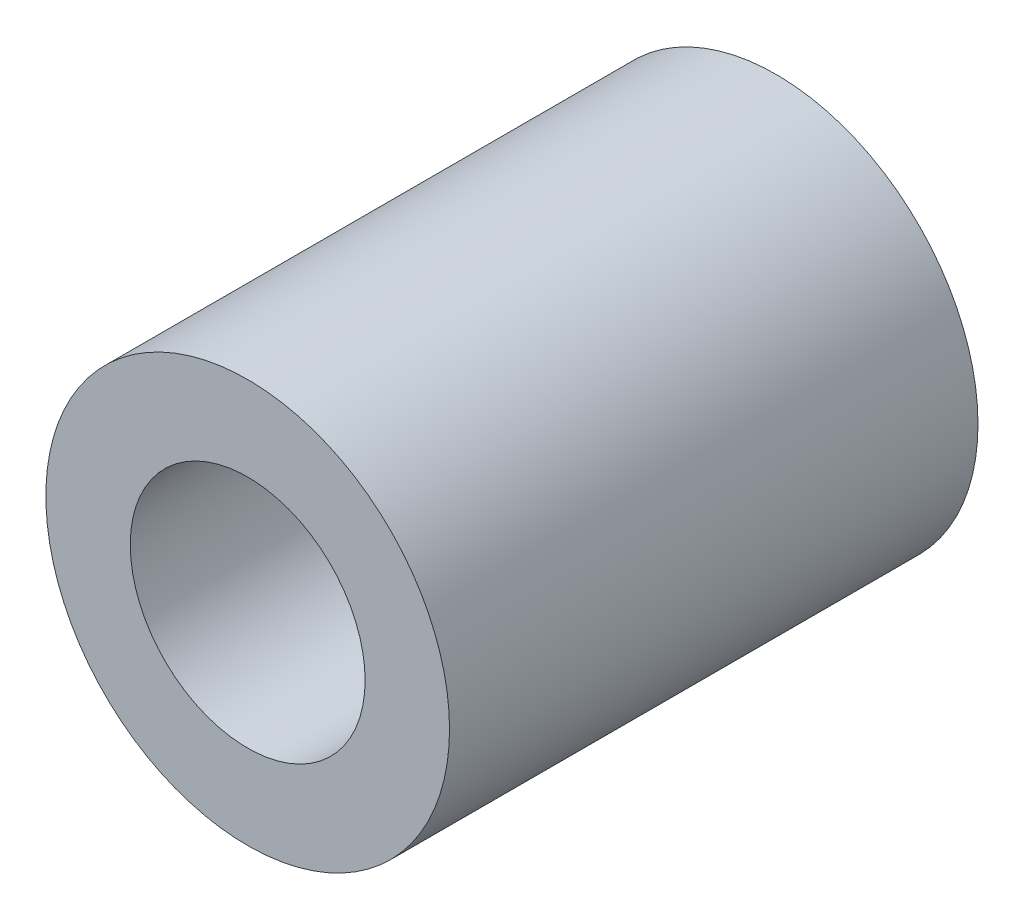
ISO-10303-21;
HEADER;
FILE_DESCRIPTION(('STEP AP214'),'2;1');
FILE_NAME('part.step','',(''),(''),'','','');
FILE_SCHEMA(('AUTOMOTIVE_DESIGN { 1 0 10303 214 1 1 1 1 }'));
ENDSEC;
DATA;
#1=APPLICATION_CONTEXT('core data for automotive mechanical design processes');
#2=APPLICATION_PROTOCOL_DEFINITION('international standard','automotive_design',2000,#1);
#3=PRODUCT_CONTEXT('',#1,'mechanical');
#4=PRODUCT('Part','Part','',(#3));
#5=PRODUCT_RELATED_PRODUCT_CATEGORY('part','',(#4));
#6=PRODUCT_DEFINITION_FORMATION('','',#4);
#7=PRODUCT_DEFINITION_CONTEXT('part definition',#1,'design');
#8=PRODUCT_DEFINITION('design','',#6,#7);
#9=PRODUCT_DEFINITION_SHAPE('','',#8);
#10=(LENGTH_UNIT() NAMED_UNIT(*) SI_UNIT(.MILLI.,.METRE.));
#11=(NAMED_UNIT(*) PLANE_ANGLE_UNIT() SI_UNIT($,.RADIAN.));
#12=(NAMED_UNIT(*) SI_UNIT($,.STERADIAN.) SOLID_ANGLE_UNIT());
#13=UNCERTAINTY_MEASURE_WITH_UNIT(LENGTH_MEASURE(1.E-05),#10,'distance_accuracy_value','');
#14=(GEOMETRIC_REPRESENTATION_CONTEXT(3) GLOBAL_UNCERTAINTY_ASSIGNED_CONTEXT((#13)) GLOBAL_UNIT_ASSIGNED_CONTEXT((#10,
#11,#12)) REPRESENTATION_CONTEXT('',''));
#15=CARTESIAN_POINT('',(0.,0.,0.));
#16=DIRECTION('',(0.,0.,1.));
#17=DIRECTION('',(1.,0.,0.));
#18=AXIS2_PLACEMENT_3D('',#15,#16,#17);
#19=CARTESIAN_POINT('',(0.,0.,7.2));
#20=DIRECTION('',(0.,0.,1.));
#21=DIRECTION('',(1.,0.,0.));
#22=AXIS2_PLACEMENT_3D('',#19,#20,#21);
#23=PLANE('',#22);
#24=CARTESIAN_POINT('',(0.,0.,7.2));
#25=DIRECTION('',(0.,0.,1.));
#26=DIRECTION('',(1.,0.,0.));
#27=AXIS2_PLACEMENT_3D('',#24,#25,#26);
#28=CIRCLE('',#27,2.75);
#29=CARTESIAN_POINT('',(2.75,0.,7.2));
#30=VERTEX_POINT('',#29);
#31=EDGE_CURVE('E10',#30,#30,#28,.T.);
#32=ORIENTED_EDGE('',*,*,#31,.T.);
#33=EDGE_LOOP('',(#32));
#34=FACE_BOUND('',#33,.T.);
#35=CARTESIAN_POINT('',(0.,0.,7.2));
#36=DIRECTION('',(0.,0.,1.));
#37=DIRECTION('',(1.,0.,0.));
#38=AXIS2_PLACEMENT_3D('',#35,#36,#37);
#39=CIRCLE('',#38,1.6);
#40=CARTESIAN_POINT('',(1.6,0.,7.2));
#41=VERTEX_POINT('',#40);
#42=EDGE_CURVE('E50',#41,#41,#39,.T.);
#43=ORIENTED_EDGE('',*,*,#42,.F.);
#44=EDGE_LOOP('',(#43));
#45=FACE_BOUND('',#44,.T.);
#46=ADVANCED_FACE('F39',(#34,#45),#23,.T.);
#47=CARTESIAN_POINT('',(0.,0.,0.));
#48=DIRECTION('',(0.,0.,1.));
#49=DIRECTION('',(1.,0.,0.));
#50=AXIS2_PLACEMENT_3D('',#47,#48,#49);
#51=PLANE('',#50);
#52=CARTESIAN_POINT('',(0.,0.,0.));
#53=DIRECTION('',(0.,0.,1.));
#54=DIRECTION('',(1.,0.,0.));
#55=AXIS2_PLACEMENT_3D('',#52,#53,#54);
#56=CIRCLE('',#55,2.75);
#57=CARTESIAN_POINT('',(2.75,0.,0.));
#58=VERTEX_POINT('',#57);
#59=EDGE_CURVE('E43',#58,#58,#56,.T.);
#60=ORIENTED_EDGE('',*,*,#59,.F.);
#61=EDGE_LOOP('',(#60));
#62=FACE_BOUND('',#61,.T.);
#63=CARTESIAN_POINT('',(0.,0.,0.));
#64=DIRECTION('',(0.,0.,1.));
#65=DIRECTION('',(1.,0.,0.));
#66=AXIS2_PLACEMENT_3D('',#63,#64,#65);
#67=CIRCLE('',#66,1.6);
#68=CARTESIAN_POINT('',(1.6,0.,0.));
#69=VERTEX_POINT('',#68);
#70=EDGE_CURVE('E52',#69,#69,#67,.T.);
#71=ORIENTED_EDGE('',*,*,#70,.T.);
#72=EDGE_LOOP('',(#71));
#73=FACE_BOUND('',#72,.T.);
#74=ADVANCED_FACE('F62',(#62,#73),#51,.F.);
#75=CARTESIAN_POINT('',(0.,0.,7.2));
#76=DIRECTION('',(0.,0.,-1.));
#77=DIRECTION('',(-1.,0.,0.));
#78=AXIS2_PLACEMENT_3D('',#75,#76,#77);
#79=CYLINDRICAL_SURFACE('',#78,2.75);
#80=ORIENTED_EDGE('',*,*,#31,.F.);
#81=EDGE_LOOP('',(#80));
#82=FACE_BOUND('',#81,.T.);
#83=ORIENTED_EDGE('',*,*,#59,.T.);
#84=EDGE_LOOP('',(#83));
#85=FACE_BOUND('',#84,.T.);
#86=ADVANCED_FACE('F41',(#82,#85),#79,.T.);
#87=CARTESIAN_POINT('',(0.,0.,7.2));
#88=DIRECTION('',(0.,0.,-1.));
#89=DIRECTION('',(-1.,0.,0.));
#90=AXIS2_PLACEMENT_3D('',#87,#88,#89);
#91=CYLINDRICAL_SURFACE('',#90,1.6);
#92=ORIENTED_EDGE('',*,*,#42,.T.);
#93=EDGE_LOOP('',(#92));
#94=FACE_BOUND('',#93,.T.);
#95=ORIENTED_EDGE('',*,*,#70,.F.);
#96=EDGE_LOOP('',(#95));
#97=FACE_BOUND('',#96,.T.);
#98=ADVANCED_FACE('F58',(#94,#97),#91,.F.);
#99=CLOSED_SHELL('',(#46,#74,#86,#98));
#100=MANIFOLD_SOLID_BREP('B2',#99);
#101=ADVANCED_BREP_SHAPE_REPRESENTATION('',(#18,#100),#14);
#102=SHAPE_DEFINITION_REPRESENTATION(#9,#101);
ENDSEC;
END-ISO-10303-21;
